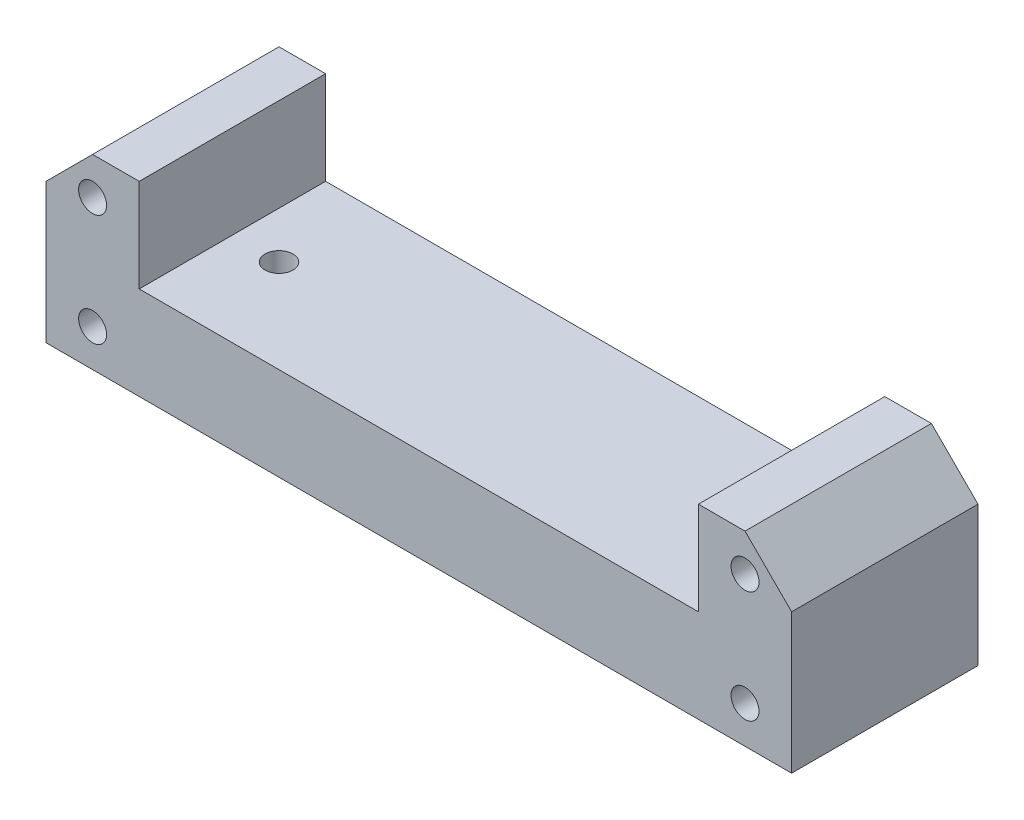
ISO-10303-21;
HEADER;
FILE_DESCRIPTION(('STEP AP214'),'2;1');
FILE_NAME('part.step','',(''),(''),'','','');
FILE_SCHEMA(('AUTOMOTIVE_DESIGN { 1 0 10303 214 1 1 1 1 }'));
ENDSEC;
DATA;
#1=APPLICATION_CONTEXT('core data for automotive mechanical design processes');
#2=APPLICATION_PROTOCOL_DEFINITION('international standard','automotive_design',2000,#1);
#3=PRODUCT_CONTEXT('',#1,'mechanical');
#4=PRODUCT('Part','Part','',(#3));
#5=PRODUCT_RELATED_PRODUCT_CATEGORY('part','',(#4));
#6=PRODUCT_DEFINITION_FORMATION('','',#4);
#7=PRODUCT_DEFINITION_CONTEXT('part definition',#1,'design');
#8=PRODUCT_DEFINITION('design','',#6,#7);
#9=PRODUCT_DEFINITION_SHAPE('','',#8);
#10=(LENGTH_UNIT() NAMED_UNIT(*) SI_UNIT(.MILLI.,.METRE.));
#11=(NAMED_UNIT(*) PLANE_ANGLE_UNIT() SI_UNIT($,.RADIAN.));
#12=(NAMED_UNIT(*) SI_UNIT($,.STERADIAN.) SOLID_ANGLE_UNIT());
#13=UNCERTAINTY_MEASURE_WITH_UNIT(LENGTH_MEASURE(1.E-05),#10,'distance_accuracy_value','');
#14=(GEOMETRIC_REPRESENTATION_CONTEXT(3) GLOBAL_UNCERTAINTY_ASSIGNED_CONTEXT((#13)) GLOBAL_UNIT_ASSIGNED_CONTEXT((#10,
#11,#12)) REPRESENTATION_CONTEXT('',''));
#15=CARTESIAN_POINT('',(0.,0.,0.));
#16=DIRECTION('',(0.,0.,1.));
#17=DIRECTION('',(1.,0.,0.));
#18=AXIS2_PLACEMENT_3D('',#15,#16,#17);
#19=CARTESIAN_POINT('',(0.,20.,0.));
#20=DIRECTION('',(0.,-1.,0.));
#21=DIRECTION('',(0.,0.,-1.));
#22=AXIS2_PLACEMENT_3D('',#19,#20,#21);
#23=PLANE('',#22);
#24=DIRECTION('',(1.,0.,0.));
#25=VECTOR('',#24,1.);
#26=CARTESIAN_POINT('',(-40.,20.,10.));
#27=LINE('',#26,#25);
#28=CARTESIAN_POINT('',(30.,20.,10.));
#29=VERTEX_POINT('',#28);
#30=CARTESIAN_POINT('',(35.,20.,10.));
#31=VERTEX_POINT('',#30);
#32=EDGE_CURVE('E155',#29,#31,#27,.T.);
#33=ORIENTED_EDGE('',*,*,#32,.T.);
#34=DIRECTION('',(0.,0.,-1.));
#35=VECTOR('',#34,1.);
#36=CARTESIAN_POINT('',(35.,20.,0.));
#37=LINE('',#36,#35);
#38=CARTESIAN_POINT('',(35.,20.,-10.));
#39=VERTEX_POINT('',#38);
#40=EDGE_CURVE('E178',#31,#39,#37,.T.);
#41=ORIENTED_EDGE('',*,*,#40,.T.);
#42=DIRECTION('',(-1.,0.,0.));
#43=VECTOR('',#42,1.);
#44=CARTESIAN_POINT('',(-40.,20.,-10.));
#45=LINE('',#44,#43);
#46=CARTESIAN_POINT('',(30.,20.,-10.));
#47=VERTEX_POINT('',#46);
#48=EDGE_CURVE('E153',#39,#47,#45,.T.);
#49=ORIENTED_EDGE('',*,*,#48,.T.);
#50=DIRECTION('',(0.,0.,-1.));
#51=VECTOR('',#50,1.);
#52=CARTESIAN_POINT('',(30.,20.,10.));
#53=LINE('',#52,#51);
#54=EDGE_CURVE('E117',#29,#47,#53,.T.);
#55=ORIENTED_EDGE('',*,*,#54,.F.);
#56=EDGE_LOOP('',(#33,#41,#49,#55));
#57=FACE_BOUND('',#56,.T.);
#58=ADVANCED_FACE('F35',(#57),#23,.F.);
#59=CARTESIAN_POINT('',(40.,20.,10.));
#60=DIRECTION('',(-1.,0.,0.));
#61=DIRECTION('',(0.,0.,1.));
#62=AXIS2_PLACEMENT_3D('',#59,#60,#61);
#63=PLANE('',#62);
#64=DIRECTION('',(0.,-1.,0.));
#65=VECTOR('',#64,1.);
#66=CARTESIAN_POINT('',(40.,20.,-10.));
#67=LINE('',#66,#65);
#68=CARTESIAN_POINT('',(40.,15.,-10.));
#69=VERTEX_POINT('',#68);
#70=CARTESIAN_POINT('',(40.,0.,-10.));
#71=VERTEX_POINT('',#70);
#72=EDGE_CURVE('E176',#69,#71,#67,.T.);
#73=ORIENTED_EDGE('',*,*,#72,.F.);
#74=DIRECTION('',(0.,0.,1.));
#75=VECTOR('',#74,1.);
#76=CARTESIAN_POINT('',(40.,15.,10.));
#77=LINE('',#76,#75);
#78=CARTESIAN_POINT('',(40.,15.,10.));
#79=VERTEX_POINT('',#78);
#80=EDGE_CURVE('E185',#69,#79,#77,.T.);
#81=ORIENTED_EDGE('',*,*,#80,.T.);
#82=DIRECTION('',(0.,-1.,0.));
#83=VECTOR('',#82,1.);
#84=CARTESIAN_POINT('',(40.,20.,10.));
#85=LINE('',#84,#83);
#86=CARTESIAN_POINT('',(40.,0.,10.));
#87=VERTEX_POINT('',#86);
#88=EDGE_CURVE('E159',#79,#87,#85,.T.);
#89=ORIENTED_EDGE('',*,*,#88,.T.);
#90=DIRECTION('',(0.,0.,-1.));
#91=VECTOR('',#90,1.);
#92=CARTESIAN_POINT('',(40.,0.,10.));
#93=LINE('',#92,#91);
#94=EDGE_CURVE('E148',#87,#71,#93,.T.);
#95=ORIENTED_EDGE('',*,*,#94,.T.);
#96=EDGE_LOOP('',(#73,#81,#89,#95));
#97=FACE_BOUND('',#96,.T.);
#98=ADVANCED_FACE('F210',(#97),#63,.F.);
#99=CARTESIAN_POINT('',(-40.,20.,-10.));
#100=DIRECTION('',(0.,0.,1.));
#101=DIRECTION('',(1.,0.,0.));
#102=AXIS2_PLACEMENT_3D('',#99,#100,#101);
#103=PLANE('',#102);
#104=CARTESIAN_POINT('',(35.,16.,-10.));
#105=DIRECTION('',(0.,0.,1.));
#106=DIRECTION('',(-1.,0.,0.));
#107=AXIS2_PLACEMENT_3D('',#104,#105,#106);
#108=CIRCLE('',#107,1.5);
#109=CARTESIAN_POINT('',(33.5,16.,-10.));
#110=VERTEX_POINT('',#109);
#111=EDGE_CURVE('E373',#110,#110,#108,.T.);
#112=ORIENTED_EDGE('',*,*,#111,.T.);
#113=EDGE_LOOP('',(#112));
#114=FACE_BOUND('',#113,.T.);
#115=CARTESIAN_POINT('',(35.,4.,-10.));
#116=DIRECTION('',(0.,0.,1.));
#117=DIRECTION('',(1.,0.,0.));
#118=AXIS2_PLACEMENT_3D('',#115,#116,#117);
#119=CIRCLE('',#118,1.5);
#120=CARTESIAN_POINT('',(36.5,4.,-10.));
#121=VERTEX_POINT('',#120);
#122=EDGE_CURVE('E411',#121,#121,#119,.T.);
#123=ORIENTED_EDGE('',*,*,#122,.T.);
#124=EDGE_LOOP('',(#123));
#125=FACE_BOUND('',#124,.T.);
#126=CARTESIAN_POINT('',(-35.,4.,-10.));
#127=DIRECTION('',(0.,0.,1.));
#128=DIRECTION('',(-1.,0.,0.));
#129=AXIS2_PLACEMENT_3D('',#126,#127,#128);
#130=CIRCLE('',#129,1.5);
#131=CARTESIAN_POINT('',(-36.5,4.,-10.));
#132=VERTEX_POINT('',#131);
#133=EDGE_CURVE('E388',#132,#132,#130,.T.);
#134=ORIENTED_EDGE('',*,*,#133,.T.);
#135=EDGE_LOOP('',(#134));
#136=FACE_BOUND('',#135,.T.);
#137=CARTESIAN_POINT('',(-35.,16.,-10.));
#138=DIRECTION('',(0.,0.,1.));
#139=DIRECTION('',(1.,0.,0.));
#140=AXIS2_PLACEMENT_3D('',#137,#138,#139);
#141=CIRCLE('',#140,1.5);
#142=CARTESIAN_POINT('',(-33.5,16.,-10.));
#143=VERTEX_POINT('',#142);
#144=EDGE_CURVE('E381',#143,#143,#141,.T.);
#145=ORIENTED_EDGE('',*,*,#144,.T.);
#146=EDGE_LOOP('',(#145));
#147=FACE_BOUND('',#146,.T.);
#148=ORIENTED_EDGE('',*,*,#48,.F.);
#149=DIRECTION('',(-0.707106781186546,0.707106781186549,0.));
#150=VECTOR('',#149,1.);
#151=CARTESIAN_POINT('',(35.,20.,-10.));
#152=LINE('',#151,#150);
#153=EDGE_CURVE('E183',#39,#69,#152,.F.);
#154=ORIENTED_EDGE('',*,*,#153,.T.);
#155=ORIENTED_EDGE('',*,*,#72,.T.);
#156=DIRECTION('',(-1.,0.,0.));
#157=VECTOR('',#156,1.);
#158=CARTESIAN_POINT('',(-40.,0.,-10.));
#159=LINE('',#158,#157);
#160=CARTESIAN_POINT('',(-40.,0.,-10.));
#161=VERTEX_POINT('',#160);
#162=EDGE_CURVE('E162',#71,#161,#159,.T.);
#163=ORIENTED_EDGE('',*,*,#162,.T.);
#164=DIRECTION('',(0.,-1.,0.));
#165=VECTOR('',#164,1.);
#166=CARTESIAN_POINT('',(-40.,20.,-10.));
#167=LINE('',#166,#165);
#168=CARTESIAN_POINT('',(-40.,15.,-10.));
#169=VERTEX_POINT('',#168);
#170=EDGE_CURVE('E174',#169,#161,#167,.T.);
#171=ORIENTED_EDGE('',*,*,#170,.F.);
#172=DIRECTION('',(-0.707106781186546,-0.70710678118655,0.));
#173=VECTOR('',#172,1.);
#174=CARTESIAN_POINT('',(-35.,20.,-10.));
#175=LINE('',#174,#173);
#176=CARTESIAN_POINT('',(-35.,20.,-10.));
#177=VERTEX_POINT('',#176);
#178=EDGE_CURVE('E181',#169,#177,#175,.F.);
#179=ORIENTED_EDGE('',*,*,#178,.T.);
#180=CARTESIAN_POINT('',(-30.,20.,-10.));
#181=VERTEX_POINT('',#180);
#182=EDGE_CURVE('E156',#181,#177,#45,.T.);
#183=ORIENTED_EDGE('',*,*,#182,.F.);
#184=DIRECTION('',(0.,1.,0.));
#185=VECTOR('',#184,1.);
#186=CARTESIAN_POINT('',(-30.,10.,-10.));
#187=LINE('',#186,#185);
#188=CARTESIAN_POINT('',(-30.,10.,-10.));
#189=VERTEX_POINT('',#188);
#190=EDGE_CURVE('E121',#189,#181,#187,.T.);
#191=ORIENTED_EDGE('',*,*,#190,.F.);
#192=DIRECTION('',(-1.,0.,0.));
#193=VECTOR('',#192,1.);
#194=CARTESIAN_POINT('',(-30.,10.,-10.));
#195=LINE('',#194,#193);
#196=CARTESIAN_POINT('',(30.,10.,-10.));
#197=VERTEX_POINT('',#196);
#198=EDGE_CURVE('E128',#197,#189,#195,.T.);
#199=ORIENTED_EDGE('',*,*,#198,.F.);
#200=DIRECTION('',(0.,1.,0.));
#201=VECTOR('',#200,1.);
#202=CARTESIAN_POINT('',(30.,10.,-10.));
#203=LINE('',#202,#201);
#204=EDGE_CURVE('E111',#197,#47,#203,.T.);
#205=ORIENTED_EDGE('',*,*,#204,.T.);
#206=EDGE_LOOP('',(#148,#154,#155,#163,#171,#179,#183,#191,#199,#205));
#207=FACE_BOUND('',#206,.T.);
#208=ADVANCED_FACE('F134',(#114,#125,#136,#147,#207),#103,.F.);
#209=CARTESIAN_POINT('',(-40.,20.,10.));
#210=DIRECTION('',(1.,0.,0.));
#211=DIRECTION('',(0.,0.,-1.));
#212=AXIS2_PLACEMENT_3D('',#209,#210,#211);
#213=PLANE('',#212);
#214=DIRECTION('',(0.,-1.,0.));
#215=VECTOR('',#214,1.);
#216=CARTESIAN_POINT('',(-40.,20.,10.));
#217=LINE('',#216,#215);
#218=CARTESIAN_POINT('',(-40.,15.,10.));
#219=VERTEX_POINT('',#218);
#220=CARTESIAN_POINT('',(-40.,0.,10.));
#221=VERTEX_POINT('',#220);
#222=EDGE_CURVE('E172',#219,#221,#217,.T.);
#223=ORIENTED_EDGE('',*,*,#222,.F.);
#224=DIRECTION('',(0.,0.,-1.));
#225=VECTOR('',#224,1.);
#226=CARTESIAN_POINT('',(-40.,15.,10.));
#227=LINE('',#226,#225);
#228=EDGE_CURVE('E11',#219,#169,#227,.T.);
#229=ORIENTED_EDGE('',*,*,#228,.T.);
#230=ORIENTED_EDGE('',*,*,#170,.T.);
#231=DIRECTION('',(0.,0.,1.));
#232=VECTOR('',#231,1.);
#233=CARTESIAN_POINT('',(-40.,0.,10.));
#234=LINE('',#233,#232);
#235=EDGE_CURVE('E165',#161,#221,#234,.T.);
#236=ORIENTED_EDGE('',*,*,#235,.T.);
#237=EDGE_LOOP('',(#223,#229,#230,#236));
#238=FACE_BOUND('',#237,.T.);
#239=ADVANCED_FACE('F200',(#238),#213,.F.);
#240=CARTESIAN_POINT('',(-40.,20.,10.));
#241=DIRECTION('',(0.,0.,-1.));
#242=DIRECTION('',(-1.,0.,0.));
#243=AXIS2_PLACEMENT_3D('',#240,#241,#242);
#244=PLANE('',#243);
#245=CARTESIAN_POINT('',(35.,16.,10.));
#246=DIRECTION('',(0.,0.,1.));
#247=DIRECTION('',(-1.,0.,0.));
#248=AXIS2_PLACEMENT_3D('',#245,#246,#247);
#249=CIRCLE('',#248,1.5);
#250=CARTESIAN_POINT('',(33.5,16.,10.));
#251=VERTEX_POINT('',#250);
#252=EDGE_CURVE('E375',#251,#251,#249,.T.);
#253=ORIENTED_EDGE('',*,*,#252,.F.);
#254=EDGE_LOOP('',(#253));
#255=FACE_BOUND('',#254,.T.);
#256=CARTESIAN_POINT('',(35.,4.,10.));
#257=DIRECTION('',(0.,0.,1.));
#258=DIRECTION('',(1.,0.,0.));
#259=AXIS2_PLACEMENT_3D('',#256,#257,#258);
#260=CIRCLE('',#259,1.5);
#261=CARTESIAN_POINT('',(36.5,4.,10.));
#262=VERTEX_POINT('',#261);
#263=EDGE_CURVE('E377',#262,#262,#260,.T.);
#264=ORIENTED_EDGE('',*,*,#263,.F.);
#265=EDGE_LOOP('',(#264));
#266=FACE_BOUND('',#265,.T.);
#267=CARTESIAN_POINT('',(-35.,4.,10.));
#268=DIRECTION('',(0.,0.,1.));
#269=DIRECTION('',(-1.,0.,0.));
#270=AXIS2_PLACEMENT_3D('',#267,#268,#269);
#271=CIRCLE('',#270,1.5);
#272=CARTESIAN_POINT('',(-36.5,4.,10.));
#273=VERTEX_POINT('',#272);
#274=EDGE_CURVE('E406',#273,#273,#271,.T.);
#275=ORIENTED_EDGE('',*,*,#274,.F.);
#276=EDGE_LOOP('',(#275));
#277=FACE_BOUND('',#276,.T.);
#278=CARTESIAN_POINT('',(-35.,16.,10.));
#279=DIRECTION('',(0.,0.,1.));
#280=DIRECTION('',(1.,0.,0.));
#281=AXIS2_PLACEMENT_3D('',#278,#279,#280);
#282=CIRCLE('',#281,1.5);
#283=CARTESIAN_POINT('',(-33.5,16.,10.));
#284=VERTEX_POINT('',#283);
#285=EDGE_CURVE('E385',#284,#284,#282,.T.);
#286=ORIENTED_EDGE('',*,*,#285,.F.);
#287=EDGE_LOOP('',(#286));
#288=FACE_BOUND('',#287,.T.);
#289=ORIENTED_EDGE('',*,*,#88,.F.);
#290=DIRECTION('',(0.707106781186546,-0.707106781186549,0.));
#291=VECTOR('',#290,1.);
#292=CARTESIAN_POINT('',(35.,20.,10.));
#293=LINE('',#292,#291);
#294=EDGE_CURVE('E188',#79,#31,#293,.F.);
#295=ORIENTED_EDGE('',*,*,#294,.T.);
#296=ORIENTED_EDGE('',*,*,#32,.F.);
#297=DIRECTION('',(0.,1.,0.));
#298=VECTOR('',#297,1.);
#299=CARTESIAN_POINT('',(30.,10.,10.));
#300=LINE('',#299,#298);
#301=CARTESIAN_POINT('',(30.,10.,10.));
#302=VERTEX_POINT('',#301);
#303=EDGE_CURVE('E146',#302,#29,#300,.T.);
#304=ORIENTED_EDGE('',*,*,#303,.F.);
#305=DIRECTION('',(1.,0.,0.));
#306=VECTOR('',#305,1.);
#307=CARTESIAN_POINT('',(-30.,10.,10.));
#308=LINE('',#307,#306);
#309=CARTESIAN_POINT('',(-30.,10.,10.));
#310=VERTEX_POINT('',#309);
#311=EDGE_CURVE('E122',#310,#302,#308,.T.);
#312=ORIENTED_EDGE('',*,*,#311,.F.);
#313=DIRECTION('',(0.,1.,0.));
#314=VECTOR('',#313,1.);
#315=CARTESIAN_POINT('',(-30.,10.,10.));
#316=LINE('',#315,#314);
#317=CARTESIAN_POINT('',(-30.,20.,10.));
#318=VERTEX_POINT('',#317);
#319=EDGE_CURVE('E149',#310,#318,#316,.T.);
#320=ORIENTED_EDGE('',*,*,#319,.T.);
#321=CARTESIAN_POINT('',(-35.,20.,10.));
#322=VERTEX_POINT('',#321);
#323=EDGE_CURVE('E157',#322,#318,#27,.T.);
#324=ORIENTED_EDGE('',*,*,#323,.F.);
#325=DIRECTION('',(0.707106781186546,0.70710678118655,0.));
#326=VECTOR('',#325,1.);
#327=CARTESIAN_POINT('',(-35.,20.,10.));
#328=LINE('',#327,#326);
#329=EDGE_CURVE('E50',#322,#219,#328,.F.);
#330=ORIENTED_EDGE('',*,*,#329,.T.);
#331=ORIENTED_EDGE('',*,*,#222,.T.);
#332=DIRECTION('',(1.,0.,0.));
#333=VECTOR('',#332,1.);
#334=CARTESIAN_POINT('',(-40.,0.,10.));
#335=LINE('',#334,#333);
#336=EDGE_CURVE('E168',#221,#87,#335,.T.);
#337=ORIENTED_EDGE('',*,*,#336,.T.);
#338=EDGE_LOOP('',(#289,#295,#296,#304,#312,#320,#324,#330,#331,#337));
#339=FACE_BOUND('',#338,.T.);
#340=ADVANCED_FACE('F195',(#255,#266,#277,#288,#339),#244,.F.);
#341=ORIENTED_EDGE('',*,*,#182,.T.);
#342=DIRECTION('',(0.,0.,1.));
#343=VECTOR('',#342,1.);
#344=CARTESIAN_POINT('',(-35.,20.,0.));
#345=LINE('',#344,#343);
#346=EDGE_CURVE('E43',#177,#322,#345,.T.);
#347=ORIENTED_EDGE('',*,*,#346,.T.);
#348=ORIENTED_EDGE('',*,*,#323,.T.);
#349=DIRECTION('',(0.,0.,1.));
#350=VECTOR('',#349,1.);
#351=CARTESIAN_POINT('',(-30.,20.,10.));
#352=LINE('',#351,#350);
#353=EDGE_CURVE('E132',#181,#318,#352,.T.);
#354=ORIENTED_EDGE('',*,*,#353,.F.);
#355=EDGE_LOOP('',(#341,#347,#348,#354));
#356=FACE_BOUND('',#355,.T.);
#357=ADVANCED_FACE('F191',(#356),#23,.F.);
#358=CARTESIAN_POINT('',(0.,0.,0.));
#359=DIRECTION('',(0.,-1.,0.));
#360=DIRECTION('',(0.,0.,-1.));
#361=AXIS2_PLACEMENT_3D('',#358,#359,#360);
#362=PLANE('',#361);
#363=CARTESIAN_POINT('',(-25.,0.,0.));
#364=DIRECTION('',(0.,1.,0.));
#365=DIRECTION('',(0.,0.,1.));
#366=AXIS2_PLACEMENT_3D('',#363,#364,#365);
#367=CIRCLE('',#366,1.5);
#368=CARTESIAN_POINT('',(-25.,0.,1.5));
#369=VERTEX_POINT('',#368);
#370=EDGE_CURVE('E143',#369,#369,#367,.T.);
#371=ORIENTED_EDGE('',*,*,#370,.T.);
#372=EDGE_LOOP('',(#371));
#373=FACE_BOUND('',#372,.T.);
#374=CARTESIAN_POINT('',(25.,0.,0.));
#375=DIRECTION('',(0.,1.,0.));
#376=DIRECTION('',(0.,0.,-1.));
#377=AXIS2_PLACEMENT_3D('',#374,#375,#376);
#378=CIRCLE('',#377,1.5);
#379=CARTESIAN_POINT('',(25.,0.,-1.5));
#380=VERTEX_POINT('',#379);
#381=EDGE_CURVE('E394',#380,#380,#378,.T.);
#382=ORIENTED_EDGE('',*,*,#381,.T.);
#383=EDGE_LOOP('',(#382));
#384=FACE_BOUND('',#383,.T.);
#385=ORIENTED_EDGE('',*,*,#94,.F.);
#386=ORIENTED_EDGE('',*,*,#336,.F.);
#387=ORIENTED_EDGE('',*,*,#235,.F.);
#388=ORIENTED_EDGE('',*,*,#162,.F.);
#389=EDGE_LOOP('',(#385,#386,#387,#388));
#390=FACE_BOUND('',#389,.T.);
#391=ADVANCED_FACE('F207',(#373,#384,#390),#362,.T.);
#392=CARTESIAN_POINT('',(30.,10.,10.));
#393=DIRECTION('',(1.,0.,0.));
#394=DIRECTION('',(0.,0.,-1.));
#395=AXIS2_PLACEMENT_3D('',#392,#393,#394);
#396=PLANE('',#395);
#397=ORIENTED_EDGE('',*,*,#54,.T.);
#398=ORIENTED_EDGE('',*,*,#204,.F.);
#399=DIRECTION('',(0.,0.,-1.));
#400=VECTOR('',#399,1.);
#401=CARTESIAN_POINT('',(30.,10.,10.));
#402=LINE('',#401,#400);
#403=EDGE_CURVE('E114',#302,#197,#402,.T.);
#404=ORIENTED_EDGE('',*,*,#403,.F.);
#405=ORIENTED_EDGE('',*,*,#303,.T.);
#406=EDGE_LOOP('',(#397,#398,#404,#405));
#407=FACE_BOUND('',#406,.T.);
#408=ADVANCED_FACE('F113',(#407),#396,.F.);
#409=CARTESIAN_POINT('',(-30.,10.,10.));
#410=DIRECTION('',(-1.,0.,0.));
#411=DIRECTION('',(0.,0.,1.));
#412=AXIS2_PLACEMENT_3D('',#409,#410,#411);
#413=PLANE('',#412);
#414=ORIENTED_EDGE('',*,*,#353,.T.);
#415=ORIENTED_EDGE('',*,*,#319,.F.);
#416=DIRECTION('',(0.,0.,1.));
#417=VECTOR('',#416,1.);
#418=CARTESIAN_POINT('',(-30.,10.,10.));
#419=LINE('',#418,#417);
#420=EDGE_CURVE('E136',#189,#310,#419,.T.);
#421=ORIENTED_EDGE('',*,*,#420,.F.);
#422=ORIENTED_EDGE('',*,*,#190,.T.);
#423=EDGE_LOOP('',(#414,#415,#421,#422));
#424=FACE_BOUND('',#423,.T.);
#425=ADVANCED_FACE('F197',(#424),#413,.F.);
#426=CARTESIAN_POINT('',(0.,10.,0.));
#427=DIRECTION('',(0.,-1.,0.));
#428=DIRECTION('',(0.,0.,-1.));
#429=AXIS2_PLACEMENT_3D('',#426,#427,#428);
#430=PLANE('',#429);
#431=CARTESIAN_POINT('',(-25.,10.,0.));
#432=DIRECTION('',(0.,1.,0.));
#433=DIRECTION('',(0.,0.,1.));
#434=AXIS2_PLACEMENT_3D('',#431,#432,#433);
#435=CIRCLE('',#434,1.5);
#436=CARTESIAN_POINT('',(-25.,10.,1.5));
#437=VERTEX_POINT('',#436);
#438=EDGE_CURVE('E391',#437,#437,#435,.T.);
#439=ORIENTED_EDGE('',*,*,#438,.F.);
#440=EDGE_LOOP('',(#439));
#441=FACE_BOUND('',#440,.T.);
#442=CARTESIAN_POINT('',(25.,10.,0.));
#443=DIRECTION('',(0.,1.,0.));
#444=DIRECTION('',(0.,0.,-1.));
#445=AXIS2_PLACEMENT_3D('',#442,#443,#444);
#446=CIRCLE('',#445,1.5);
#447=CARTESIAN_POINT('',(25.,10.,-1.5));
#448=VERTEX_POINT('',#447);
#449=EDGE_CURVE('E384',#448,#448,#446,.T.);
#450=ORIENTED_EDGE('',*,*,#449,.F.);
#451=EDGE_LOOP('',(#450));
#452=FACE_BOUND('',#451,.T.);
#453=ORIENTED_EDGE('',*,*,#403,.T.);
#454=ORIENTED_EDGE('',*,*,#198,.T.);
#455=ORIENTED_EDGE('',*,*,#420,.T.);
#456=ORIENTED_EDGE('',*,*,#311,.T.);
#457=EDGE_LOOP('',(#453,#454,#455,#456));
#458=FACE_BOUND('',#457,.T.);
#459=ADVANCED_FACE('F126',(#441,#452,#458),#430,.F.);
#460=CARTESIAN_POINT('',(25.,0.,0.));
#461=DIRECTION('',(0.,1.,0.));
#462=DIRECTION('',(0.,0.,1.));
#463=AXIS2_PLACEMENT_3D('',#460,#461,#462);
#464=CYLINDRICAL_SURFACE('',#463,1.5);
#465=ORIENTED_EDGE('',*,*,#381,.F.);
#466=EDGE_LOOP('',(#465));
#467=FACE_BOUND('',#466,.T.);
#468=ORIENTED_EDGE('',*,*,#449,.T.);
#469=EDGE_LOOP('',(#468));
#470=FACE_BOUND('',#469,.T.);
#471=ADVANCED_FACE('F250',(#467,#470),#464,.F.);
#472=CARTESIAN_POINT('',(-25.,0.,0.));
#473=DIRECTION('',(0.,1.,0.));
#474=DIRECTION('',(0.,0.,1.));
#475=AXIS2_PLACEMENT_3D('',#472,#473,#474);
#476=CYLINDRICAL_SURFACE('',#475,1.5);
#477=ORIENTED_EDGE('',*,*,#370,.F.);
#478=EDGE_LOOP('',(#477));
#479=FACE_BOUND('',#478,.T.);
#480=ORIENTED_EDGE('',*,*,#438,.T.);
#481=EDGE_LOOP('',(#480));
#482=FACE_BOUND('',#481,.T.);
#483=ADVANCED_FACE('F244',(#479,#482),#476,.F.);
#484=CARTESIAN_POINT('',(35.,20.,0.));
#485=DIRECTION('',(-0.707106781186549,-0.707106781186546,0.));
#486=DIRECTION('',(0.,0.,-1.));
#487=AXIS2_PLACEMENT_3D('',#484,#485,#486);
#488=PLANE('',#487);
#489=ORIENTED_EDGE('',*,*,#294,.F.);
#490=ORIENTED_EDGE('',*,*,#80,.F.);
#491=ORIENTED_EDGE('',*,*,#153,.F.);
#492=ORIENTED_EDGE('',*,*,#40,.F.);
#493=EDGE_LOOP('',(#489,#490,#491,#492));
#494=FACE_BOUND('',#493,.T.);
#495=ADVANCED_FACE('F213',(#494),#488,.F.);
#496=CARTESIAN_POINT('',(-35.,20.,0.));
#497=DIRECTION('',(0.70710678118655,-0.707106781186546,0.));
#498=DIRECTION('',(0.,0.,1.));
#499=AXIS2_PLACEMENT_3D('',#496,#497,#498);
#500=PLANE('',#499);
#501=ORIENTED_EDGE('',*,*,#178,.F.);
#502=ORIENTED_EDGE('',*,*,#228,.F.);
#503=ORIENTED_EDGE('',*,*,#329,.F.);
#504=ORIENTED_EDGE('',*,*,#346,.F.);
#505=EDGE_LOOP('',(#501,#502,#503,#504));
#506=FACE_BOUND('',#505,.T.);
#507=ADVANCED_FACE('F37',(#506),#500,.F.);
#508=CARTESIAN_POINT('',(-35.,16.,-10.));
#509=DIRECTION('',(0.,0.,1.));
#510=DIRECTION('',(1.,0.,0.));
#511=AXIS2_PLACEMENT_3D('',#508,#509,#510);
#512=CYLINDRICAL_SURFACE('',#511,1.5);
#513=ORIENTED_EDGE('',*,*,#144,.F.);
#514=EDGE_LOOP('',(#513));
#515=FACE_BOUND('',#514,.T.);
#516=ORIENTED_EDGE('',*,*,#285,.T.);
#517=EDGE_LOOP('',(#516));
#518=FACE_BOUND('',#517,.T.);
#519=ADVANCED_FACE('F249',(#515,#518),#512,.F.);
#520=CARTESIAN_POINT('',(-35.,4.,-10.));
#521=DIRECTION('',(0.,0.,1.));
#522=DIRECTION('',(1.,0.,0.));
#523=AXIS2_PLACEMENT_3D('',#520,#521,#522);
#524=CYLINDRICAL_SURFACE('',#523,1.5);
#525=ORIENTED_EDGE('',*,*,#133,.F.);
#526=EDGE_LOOP('',(#525));
#527=FACE_BOUND('',#526,.T.);
#528=ORIENTED_EDGE('',*,*,#274,.T.);
#529=EDGE_LOOP('',(#528));
#530=FACE_BOUND('',#529,.T.);
#531=ADVANCED_FACE('F338',(#527,#530),#524,.F.);
#532=CARTESIAN_POINT('',(35.,4.,-10.));
#533=DIRECTION('',(0.,0.,1.));
#534=DIRECTION('',(1.,0.,0.));
#535=AXIS2_PLACEMENT_3D('',#532,#533,#534);
#536=CYLINDRICAL_SURFACE('',#535,1.5);
#537=ORIENTED_EDGE('',*,*,#122,.F.);
#538=EDGE_LOOP('',(#537));
#539=FACE_BOUND('',#538,.T.);
#540=ORIENTED_EDGE('',*,*,#263,.T.);
#541=EDGE_LOOP('',(#540));
#542=FACE_BOUND('',#541,.T.);
#543=ADVANCED_FACE('F347',(#539,#542),#536,.F.);
#544=CARTESIAN_POINT('',(35.,16.,-10.));
#545=DIRECTION('',(0.,0.,1.));
#546=DIRECTION('',(1.,0.,0.));
#547=AXIS2_PLACEMENT_3D('',#544,#545,#546);
#548=CYLINDRICAL_SURFACE('',#547,1.5);
#549=ORIENTED_EDGE('',*,*,#111,.F.);
#550=EDGE_LOOP('',(#549));
#551=FACE_BOUND('',#550,.T.);
#552=ORIENTED_EDGE('',*,*,#252,.T.);
#553=EDGE_LOOP('',(#552));
#554=FACE_BOUND('',#553,.T.);
#555=ADVANCED_FACE('F357',(#551,#554),#548,.F.);
#556=CLOSED_SHELL('',(#58,#98,#208,#239,#340,#357,#391,#408,#425,#459,#471,#483,#495,#507,#519,
#531,#543,#555));
#557=MANIFOLD_SOLID_BREP('B2',#556);
#558=ADVANCED_BREP_SHAPE_REPRESENTATION('',(#18,#557),#14);
#559=SHAPE_DEFINITION_REPRESENTATION(#9,#558);
ENDSEC;
END-ISO-10303-21;
